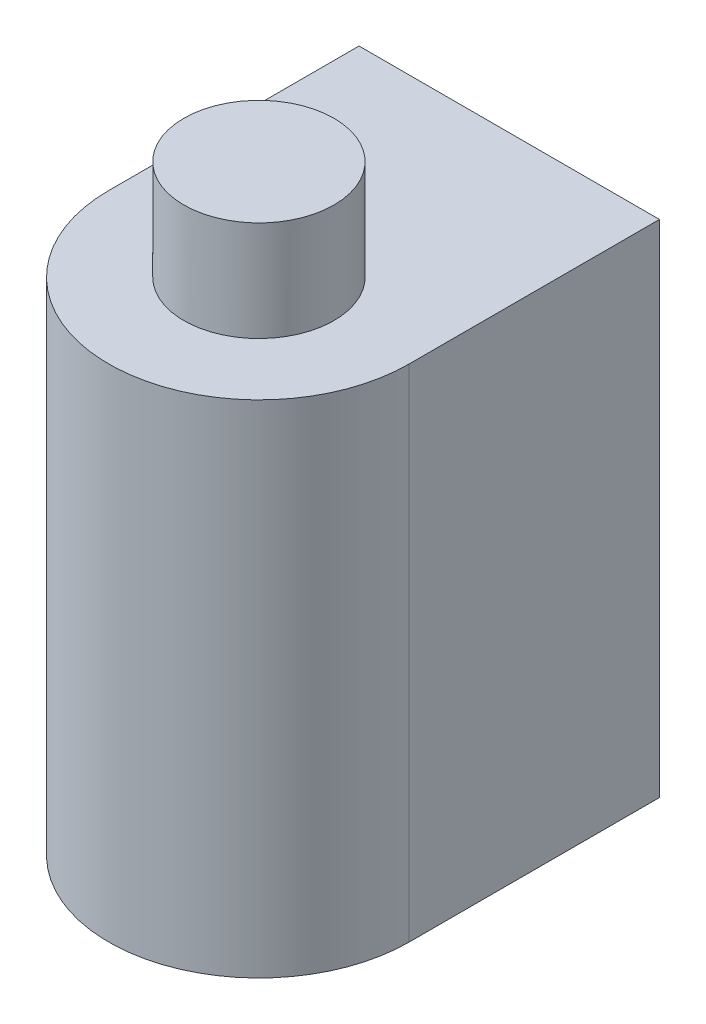
ISO-10303-21;
HEADER;
FILE_DESCRIPTION(('STEP AP214'),'2;1');
FILE_NAME('part.step','',(''),(''),'','','');
FILE_SCHEMA(('AUTOMOTIVE_DESIGN { 1 0 10303 214 1 1 1 1 }'));
ENDSEC;
DATA;
#1=APPLICATION_CONTEXT('core data for automotive mechanical design processes');
#2=APPLICATION_PROTOCOL_DEFINITION('international standard','automotive_design',2000,#1);
#3=PRODUCT_CONTEXT('',#1,'mechanical');
#4=PRODUCT('Part','Part','',(#3));
#5=PRODUCT_RELATED_PRODUCT_CATEGORY('part','',(#4));
#6=PRODUCT_DEFINITION_FORMATION('','',#4);
#7=PRODUCT_DEFINITION_CONTEXT('part definition',#1,'design');
#8=PRODUCT_DEFINITION('design','',#6,#7);
#9=PRODUCT_DEFINITION_SHAPE('','',#8);
#10=(LENGTH_UNIT() NAMED_UNIT(*) SI_UNIT(.MILLI.,.METRE.));
#11=(NAMED_UNIT(*) PLANE_ANGLE_UNIT() SI_UNIT($,.RADIAN.));
#12=(NAMED_UNIT(*) SI_UNIT($,.STERADIAN.) SOLID_ANGLE_UNIT());
#13=UNCERTAINTY_MEASURE_WITH_UNIT(LENGTH_MEASURE(1.E-05),#10,'distance_accuracy_value','');
#14=(GEOMETRIC_REPRESENTATION_CONTEXT(3) GLOBAL_UNCERTAINTY_ASSIGNED_CONTEXT((#13)) GLOBAL_UNIT_ASSIGNED_CONTEXT((#10,
#11,#12)) REPRESENTATION_CONTEXT('',''));
#15=CARTESIAN_POINT('',(0.,0.,0.));
#16=DIRECTION('',(0.,0.,1.));
#17=DIRECTION('',(1.,0.,0.));
#18=AXIS2_PLACEMENT_3D('',#15,#16,#17);
#19=CARTESIAN_POINT('',(0.,5.,5.));
#20=DIRECTION('',(0.,1.,0.));
#21=DIRECTION('',(-1.,0.,0.));
#22=AXIS2_PLACEMENT_3D('',#19,#20,#21);
#23=CYLINDRICAL_SURFACE('',#22,3.);
#24=DIRECTION('',(0.,-1.,0.));
#25=VECTOR('',#24,1.);
#26=CARTESIAN_POINT('',(3.,5.,5.));
#27=LINE('',#26,#25);
#28=CARTESIAN_POINT('',(3.,5.,5.));
#29=VERTEX_POINT('',#28);
#30=CARTESIAN_POINT('',(3.,-5.,5.));
#31=VERTEX_POINT('',#30);
#32=EDGE_CURVE('E86',#29,#31,#27,.T.);
#33=ORIENTED_EDGE('',*,*,#32,.F.);
#34=CARTESIAN_POINT('',(0.,5.,5.));
#35=DIRECTION('',(0.,-1.,0.));
#36=DIRECTION('',(0.,0.,-1.));
#37=AXIS2_PLACEMENT_3D('',#34,#35,#36);
#38=CIRCLE('',#37,3.);
#39=CARTESIAN_POINT('',(-3.,5.,5.));
#40=VERTEX_POINT('',#39);
#41=EDGE_CURVE('E52',#40,#29,#38,.F.);
#42=ORIENTED_EDGE('',*,*,#41,.F.);
#43=DIRECTION('',(0.,-1.,0.));
#44=VECTOR('',#43,1.);
#45=CARTESIAN_POINT('',(-3.,5.,5.));
#46=LINE('',#45,#44);
#47=CARTESIAN_POINT('',(-3.,-5.,5.));
#48=VERTEX_POINT('',#47);
#49=EDGE_CURVE('E113',#48,#40,#46,.F.);
#50=ORIENTED_EDGE('',*,*,#49,.F.);
#51=CARTESIAN_POINT('',(0.,-5.,5.));
#52=DIRECTION('',(0.,1.,0.));
#53=DIRECTION('',(0.,0.,1.));
#54=AXIS2_PLACEMENT_3D('',#51,#52,#53);
#55=CIRCLE('',#54,3.);
#56=EDGE_CURVE('E45',#31,#48,#55,.F.);
#57=ORIENTED_EDGE('',*,*,#56,.F.);
#58=EDGE_LOOP('',(#33,#42,#50,#57));
#59=FACE_BOUND('',#58,.T.);
#60=ADVANCED_FACE('F37',(#59),#23,.T.);
#61=CARTESIAN_POINT('',(3.,5.,8.));
#62=DIRECTION('',(-1.,0.,0.));
#63=DIRECTION('',(0.,-1.,0.));
#64=AXIS2_PLACEMENT_3D('',#61,#62,#63);
#65=PLANE('',#64);
#66=DIRECTION('',(0.,0.,-1.));
#67=VECTOR('',#66,1.);
#68=CARTESIAN_POINT('',(3.,5.,8.));
#69=LINE('',#68,#67);
#70=CARTESIAN_POINT('',(3.,5.,0.));
#71=VERTEX_POINT('',#70);
#72=EDGE_CURVE('E77',#29,#71,#69,.T.);
#73=ORIENTED_EDGE('',*,*,#72,.F.);
#74=ORIENTED_EDGE('',*,*,#32,.T.);
#75=DIRECTION('',(0.,0.,-1.));
#76=VECTOR('',#75,1.);
#77=CARTESIAN_POINT('',(3.,-5.,8.));
#78=LINE('',#77,#76);
#79=CARTESIAN_POINT('',(3.,-5.,0.));
#80=VERTEX_POINT('',#79);
#81=EDGE_CURVE('E98',#31,#80,#78,.T.);
#82=ORIENTED_EDGE('',*,*,#81,.T.);
#83=DIRECTION('',(0.,1.,0.));
#84=VECTOR('',#83,1.);
#85=CARTESIAN_POINT('',(3.,5.,0.));
#86=LINE('',#85,#84);
#87=EDGE_CURVE('E93',#80,#71,#86,.T.);
#88=ORIENTED_EDGE('',*,*,#87,.T.);
#89=EDGE_LOOP('',(#73,#74,#82,#88));
#90=FACE_BOUND('',#89,.T.);
#91=ADVANCED_FACE('F97',(#90),#65,.F.);
#92=CARTESIAN_POINT('',(-3.,5.,8.));
#93=DIRECTION('',(0.,-1.,0.));
#94=DIRECTION('',(0.,0.,-1.));
#95=AXIS2_PLACEMENT_3D('',#92,#93,#94);
#96=PLANE('',#95);
#97=CARTESIAN_POINT('',(0.,5.,5.));
#98=DIRECTION('',(0.,-1.,0.));
#99=DIRECTION('',(0.,0.,-1.));
#100=AXIS2_PLACEMENT_3D('',#97,#98,#99);
#101=CIRCLE('',#100,1.5);
#102=CARTESIAN_POINT('',(0.,5.,3.5));
#103=VERTEX_POINT('',#102);
#104=EDGE_CURVE('E11',#103,#103,#101,.F.);
#105=ORIENTED_EDGE('',*,*,#104,.F.);
#106=EDGE_LOOP('',(#105));
#107=FACE_BOUND('',#106,.T.);
#108=DIRECTION('',(0.,0.,-1.));
#109=VECTOR('',#108,1.);
#110=CARTESIAN_POINT('',(-3.,5.,8.));
#111=LINE('',#110,#109);
#112=CARTESIAN_POINT('',(-3.,5.,0.));
#113=VERTEX_POINT('',#112);
#114=EDGE_CURVE('E87',#40,#113,#111,.T.);
#115=ORIENTED_EDGE('',*,*,#114,.F.);
#116=ORIENTED_EDGE('',*,*,#41,.T.);
#117=ORIENTED_EDGE('',*,*,#72,.T.);
#118=DIRECTION('',(-1.,0.,0.));
#119=VECTOR('',#118,1.);
#120=CARTESIAN_POINT('',(-3.,5.,0.));
#121=LINE('',#120,#119);
#122=EDGE_CURVE('E81',#71,#113,#121,.T.);
#123=ORIENTED_EDGE('',*,*,#122,.T.);
#124=EDGE_LOOP('',(#115,#116,#117,#123));
#125=FACE_BOUND('',#124,.T.);
#126=ADVANCED_FACE('F80',(#107,#125),#96,.F.);
#127=CARTESIAN_POINT('',(-3.,5.,8.));
#128=DIRECTION('',(1.,0.,0.));
#129=DIRECTION('',(0.,1.,0.));
#130=AXIS2_PLACEMENT_3D('',#127,#128,#129);
#131=PLANE('',#130);
#132=DIRECTION('',(0.,0.,-1.));
#133=VECTOR('',#132,1.);
#134=CARTESIAN_POINT('',(-3.,-5.,8.));
#135=LINE('',#134,#133);
#136=CARTESIAN_POINT('',(-3.,-5.,0.));
#137=VERTEX_POINT('',#136);
#138=EDGE_CURVE('E109',#48,#137,#135,.T.);
#139=ORIENTED_EDGE('',*,*,#138,.F.);
#140=ORIENTED_EDGE('',*,*,#49,.T.);
#141=ORIENTED_EDGE('',*,*,#114,.T.);
#142=DIRECTION('',(0.,-1.,0.));
#143=VECTOR('',#142,1.);
#144=CARTESIAN_POINT('',(-3.,5.,0.));
#145=LINE('',#144,#143);
#146=EDGE_CURVE('E95',#113,#137,#145,.T.);
#147=ORIENTED_EDGE('',*,*,#146,.T.);
#148=EDGE_LOOP('',(#139,#140,#141,#147));
#149=FACE_BOUND('',#148,.T.);
#150=ADVANCED_FACE('F117',(#149),#131,.F.);
#151=CARTESIAN_POINT('',(-3.,-5.,8.));
#152=DIRECTION('',(0.,1.,0.));
#153=DIRECTION('',(0.,0.,1.));
#154=AXIS2_PLACEMENT_3D('',#151,#152,#153);
#155=PLANE('',#154);
#156=ORIENTED_EDGE('',*,*,#81,.F.);
#157=ORIENTED_EDGE('',*,*,#56,.T.);
#158=ORIENTED_EDGE('',*,*,#138,.T.);
#159=DIRECTION('',(1.,0.,0.));
#160=VECTOR('',#159,1.);
#161=CARTESIAN_POINT('',(-3.,-5.,0.));
#162=LINE('',#161,#160);
#163=EDGE_CURVE('E106',#137,#80,#162,.T.);
#164=ORIENTED_EDGE('',*,*,#163,.T.);
#165=EDGE_LOOP('',(#156,#157,#158,#164));
#166=FACE_BOUND('',#165,.T.);
#167=ADVANCED_FACE('F118',(#166),#155,.F.);
#168=CARTESIAN_POINT('',(0.,0.,0.));
#169=DIRECTION('',(0.,0.,1.));
#170=DIRECTION('',(1.,0.,0.));
#171=AXIS2_PLACEMENT_3D('',#168,#169,#170);
#172=PLANE('',#171);
#173=ORIENTED_EDGE('',*,*,#87,.F.);
#174=ORIENTED_EDGE('',*,*,#163,.F.);
#175=ORIENTED_EDGE('',*,*,#146,.F.);
#176=ORIENTED_EDGE('',*,*,#122,.F.);
#177=EDGE_LOOP('',(#173,#174,#175,#176));
#178=FACE_BOUND('',#177,.T.);
#179=ADVANCED_FACE('F91',(#178),#172,.F.);
#180=CARTESIAN_POINT('',(0.,7.,5.));
#181=DIRECTION('',(0.,-1.,0.));
#182=DIRECTION('',(0.,0.,-1.));
#183=AXIS2_PLACEMENT_3D('',#180,#181,#182);
#184=CYLINDRICAL_SURFACE('',#183,1.5);
#185=CARTESIAN_POINT('',(0.,7.,5.));
#186=DIRECTION('',(0.,1.,0.));
#187=DIRECTION('',(0.,0.,1.));
#188=AXIS2_PLACEMENT_3D('',#185,#186,#187);
#189=CIRCLE('',#188,1.5);
#190=CARTESIAN_POINT('',(0.,7.,6.5));
#191=VERTEX_POINT('',#190);
#192=EDGE_CURVE('E100',#191,#191,#189,.T.);
#193=ORIENTED_EDGE('',*,*,#192,.F.);
#194=EDGE_LOOP('',(#193));
#195=FACE_BOUND('',#194,.T.);
#196=ORIENTED_EDGE('',*,*,#104,.T.);
#197=EDGE_LOOP('',(#196));
#198=FACE_BOUND('',#197,.T.);
#199=ADVANCED_FACE('F125',(#195,#198),#184,.T.);
#200=CARTESIAN_POINT('',(0.,7.,5.));
#201=DIRECTION('',(0.,1.,0.));
#202=DIRECTION('',(0.,0.,1.));
#203=AXIS2_PLACEMENT_3D('',#200,#201,#202);
#204=PLANE('',#203);
#205=ORIENTED_EDGE('',*,*,#192,.T.);
#206=EDGE_LOOP('',(#205));
#207=FACE_BOUND('',#206,.T.);
#208=ADVANCED_FACE('F142',(#207),#204,.T.);
#209=CLOSED_SHELL('',(#60,#91,#126,#150,#167,#179,#199,#208));
#210=MANIFOLD_SOLID_BREP('B2',#209);
#211=ADVANCED_BREP_SHAPE_REPRESENTATION('',(#18,#210),#14);
#212=SHAPE_DEFINITION_REPRESENTATION(#9,#211);
ENDSEC;
END-ISO-10303-21;
